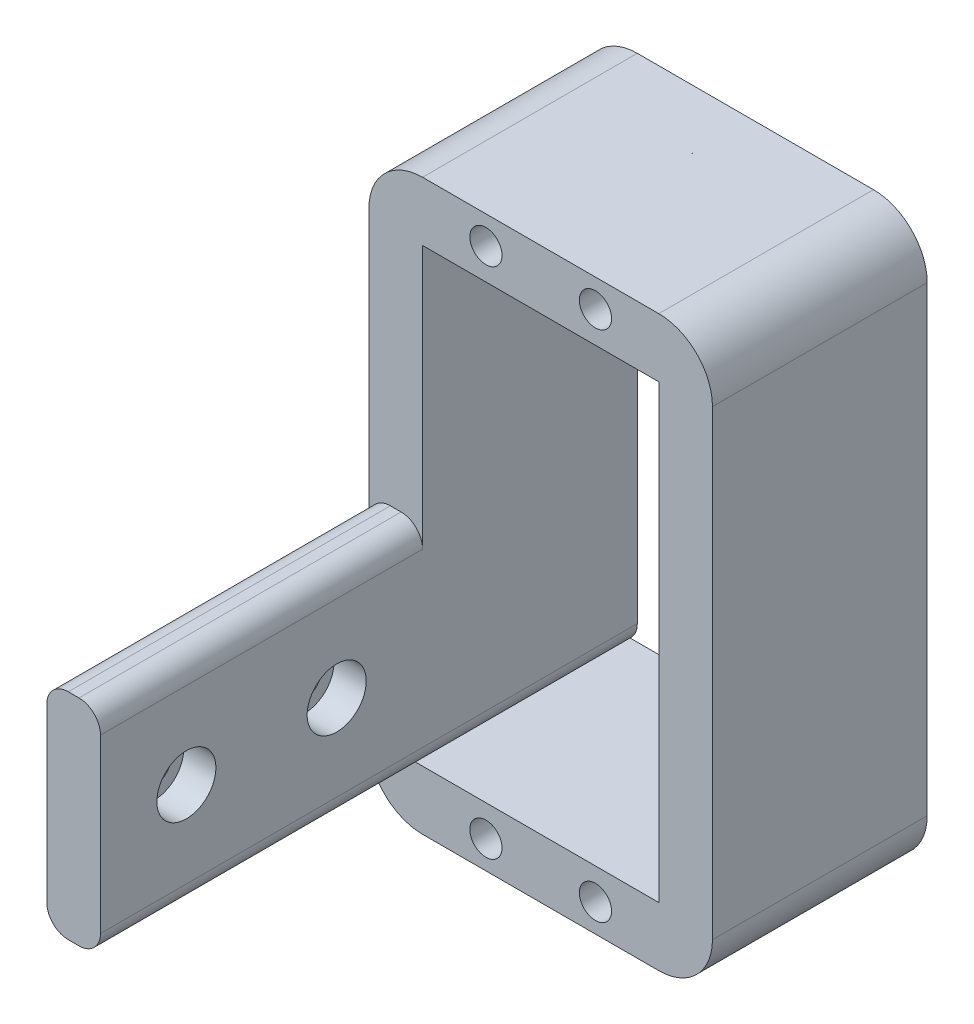
ISO-10303-21;
HEADER;
FILE_DESCRIPTION(('STEP AP214'),'2;1');
FILE_NAME('part.step','',(''),(''),'','','');
FILE_SCHEMA(('AUTOMOTIVE_DESIGN { 1 0 10303 214 1 1 1 1 }'));
ENDSEC;
DATA;
#1=APPLICATION_CONTEXT('core data for automotive mechanical design processes');
#2=APPLICATION_PROTOCOL_DEFINITION('international standard','automotive_design',2000,#1);
#3=PRODUCT_CONTEXT('',#1,'mechanical');
#4=PRODUCT('Part','Part','',(#3));
#5=PRODUCT_RELATED_PRODUCT_CATEGORY('part','',(#4));
#6=PRODUCT_DEFINITION_FORMATION('','',#4);
#7=PRODUCT_DEFINITION_CONTEXT('part definition',#1,'design');
#8=PRODUCT_DEFINITION('design','',#6,#7);
#9=PRODUCT_DEFINITION_SHAPE('','',#8);
#10=(LENGTH_UNIT() NAMED_UNIT(*) SI_UNIT(.MILLI.,.METRE.));
#11=(NAMED_UNIT(*) PLANE_ANGLE_UNIT() SI_UNIT($,.RADIAN.));
#12=(NAMED_UNIT(*) SI_UNIT($,.STERADIAN.) SOLID_ANGLE_UNIT());
#13=UNCERTAINTY_MEASURE_WITH_UNIT(LENGTH_MEASURE(1.E-05),#10,'distance_accuracy_value','');
#14=(GEOMETRIC_REPRESENTATION_CONTEXT(3) GLOBAL_UNCERTAINTY_ASSIGNED_CONTEXT((#13)) GLOBAL_UNIT_ASSIGNED_CONTEXT((#10,
#11,#12)) REPRESENTATION_CONTEXT('',''));
#15=CARTESIAN_POINT('',(0.,0.,0.));
#16=DIRECTION('',(0.,0.,1.));
#17=DIRECTION('',(1.,0.,0.));
#18=AXIS2_PLACEMENT_3D('',#15,#16,#17);
#19=CARTESIAN_POINT('',(0.,0.,20.));
#20=DIRECTION('',(0.,0.,1.));
#21=DIRECTION('',(1.,0.,0.));
#22=AXIS2_PLACEMENT_3D('',#19,#20,#21);
#23=PLANE('',#22);
#24=CARTESIAN_POINT('',(-5.1,-23.8999999999999,20.));
#25=DIRECTION('',(0.,0.,1.));
#26=DIRECTION('',(1.,0.,0.));
#27=AXIS2_PLACEMENT_3D('',#24,#25,#26);
#28=CIRCLE('',#27,1.5);
#29=CARTESIAN_POINT('',(-3.6,-23.8999999999999,20.));
#30=VERTEX_POINT('',#29);
#31=EDGE_CURVE('E352',#30,#30,#28,.T.);
#32=ORIENTED_EDGE('',*,*,#31,.F.);
#33=EDGE_LOOP('',(#32));
#34=FACE_BOUND('',#33,.T.);
#35=CARTESIAN_POINT('',(5.1,23.9000000000001,20.));
#36=DIRECTION('',(0.,0.,1.));
#37=DIRECTION('',(1.,0.,0.));
#38=AXIS2_PLACEMENT_3D('',#35,#36,#37);
#39=CIRCLE('',#38,1.5);
#40=CARTESIAN_POINT('',(6.6,23.9000000000001,20.));
#41=VERTEX_POINT('',#40);
#42=EDGE_CURVE('E357',#41,#41,#39,.T.);
#43=ORIENTED_EDGE('',*,*,#42,.F.);
#44=EDGE_LOOP('',(#43));
#45=FACE_BOUND('',#44,.T.);
#46=CARTESIAN_POINT('',(-5.1,23.9000000000001,20.));
#47=DIRECTION('',(0.,0.,1.));
#48=DIRECTION('',(1.,0.,0.));
#49=AXIS2_PLACEMENT_3D('',#46,#47,#48);
#50=CIRCLE('',#49,1.5);
#51=CARTESIAN_POINT('',(-3.6,23.9000000000001,20.));
#52=VERTEX_POINT('',#51);
#53=EDGE_CURVE('E360',#52,#52,#50,.T.);
#54=ORIENTED_EDGE('',*,*,#53,.F.);
#55=EDGE_LOOP('',(#54));
#56=FACE_BOUND('',#55,.T.);
#57=CARTESIAN_POINT('',(5.1,-23.8999999999999,20.));
#58=DIRECTION('',(0.,0.,1.));
#59=DIRECTION('',(1.,0.,0.));
#60=AXIS2_PLACEMENT_3D('',#57,#58,#59);
#61=CIRCLE('',#60,1.5);
#62=CARTESIAN_POINT('',(6.6,-23.8999999999999,20.));
#63=VERTEX_POINT('',#62);
#64=EDGE_CURVE('E363',#63,#63,#61,.T.);
#65=ORIENTED_EDGE('',*,*,#64,.F.);
#66=EDGE_LOOP('',(#65));
#67=FACE_BOUND('',#66,.T.);
#68=DIRECTION('',(1.,0.,0.));
#69=VECTOR('',#68,1.);
#70=CARTESIAN_POINT('',(-16.,-21.5,20.));
#71=LINE('',#70,#69);
#72=CARTESIAN_POINT('',(-14.,-21.5,20.));
#73=VERTEX_POINT('',#72);
#74=CARTESIAN_POINT('',(-13.,-21.5,20.));
#75=VERTEX_POINT('',#74);
#76=EDGE_CURVE('E310',#73,#75,#71,.T.);
#77=ORIENTED_EDGE('',*,*,#76,.F.);
#78=CARTESIAN_POINT('',(-14.,-19.5,20.));
#79=DIRECTION('',(0.,0.,1.));
#80=DIRECTION('',(1.,0.,0.));
#81=AXIS2_PLACEMENT_3D('',#78,#79,#80);
#82=CIRCLE('',#81,2.);
#83=CARTESIAN_POINT('',(-16.,-19.5,20.));
#84=VERTEX_POINT('',#83);
#85=EDGE_CURVE('E299',#73,#84,#82,.F.);
#86=ORIENTED_EDGE('',*,*,#85,.T.);
#87=DIRECTION('',(0.,1.,0.));
#88=VECTOR('',#87,1.);
#89=CARTESIAN_POINT('',(-16.,0.,20.));
#90=LINE('',#89,#88);
#91=CARTESIAN_POINT('',(-16.,-21.5,20.));
#92=VERTEX_POINT('',#91);
#93=EDGE_CURVE('E54',#92,#84,#90,.T.);
#94=ORIENTED_EDGE('',*,*,#93,.F.);
#95=CARTESIAN_POINT('',(-11.,-21.5,20.));
#96=DIRECTION('',(0.,0.,1.));
#97=DIRECTION('',(1.,0.,0.));
#98=AXIS2_PLACEMENT_3D('',#95,#96,#97);
#99=CIRCLE('',#98,5.);
#100=CARTESIAN_POINT('',(-11.,-26.5,20.));
#101=VERTEX_POINT('',#100);
#102=EDGE_CURVE('E253',#92,#101,#99,.T.);
#103=ORIENTED_EDGE('',*,*,#102,.T.);
#104=DIRECTION('',(1.,0.,0.));
#105=VECTOR('',#104,1.);
#106=CARTESIAN_POINT('',(-16.,-26.5,20.));
#107=LINE('',#106,#105);
#108=CARTESIAN_POINT('',(11.,-26.5,20.));
#109=VERTEX_POINT('',#108);
#110=EDGE_CURVE('E216',#101,#109,#107,.T.);
#111=ORIENTED_EDGE('',*,*,#110,.T.);
#112=CARTESIAN_POINT('',(11.,-21.5,20.));
#113=DIRECTION('',(0.,0.,1.));
#114=DIRECTION('',(1.,0.,0.));
#115=AXIS2_PLACEMENT_3D('',#112,#113,#114);
#116=CIRCLE('',#115,5.);
#117=CARTESIAN_POINT('',(16.,-21.5,20.));
#118=VERTEX_POINT('',#117);
#119=EDGE_CURVE('E251',#109,#118,#116,.T.);
#120=ORIENTED_EDGE('',*,*,#119,.T.);
#121=DIRECTION('',(0.,1.,0.));
#122=VECTOR('',#121,1.);
#123=CARTESIAN_POINT('',(16.,26.5,20.));
#124=LINE('',#123,#122);
#125=CARTESIAN_POINT('',(16.,21.5,20.));
#126=VERTEX_POINT('',#125);
#127=EDGE_CURVE('E207',#118,#126,#124,.T.);
#128=ORIENTED_EDGE('',*,*,#127,.T.);
#129=CARTESIAN_POINT('',(11.,21.5,20.));
#130=DIRECTION('',(0.,0.,1.));
#131=DIRECTION('',(1.,0.,0.));
#132=AXIS2_PLACEMENT_3D('',#129,#130,#131);
#133=CIRCLE('',#132,5.);
#134=CARTESIAN_POINT('',(11.,26.5,20.));
#135=VERTEX_POINT('',#134);
#136=EDGE_CURVE('E247',#126,#135,#133,.T.);
#137=ORIENTED_EDGE('',*,*,#136,.T.);
#138=DIRECTION('',(-1.,0.,0.));
#139=VECTOR('',#138,1.);
#140=CARTESIAN_POINT('',(-16.,26.5,20.));
#141=LINE('',#140,#139);
#142=CARTESIAN_POINT('',(-11.,26.5,20.));
#143=VERTEX_POINT('',#142);
#144=EDGE_CURVE('E210',#135,#143,#141,.T.);
#145=ORIENTED_EDGE('',*,*,#144,.T.);
#146=CARTESIAN_POINT('',(-11.,21.5,20.));
#147=DIRECTION('',(0.,0.,1.));
#148=DIRECTION('',(1.,0.,0.));
#149=AXIS2_PLACEMENT_3D('',#146,#147,#148);
#150=CIRCLE('',#149,5.);
#151=CARTESIAN_POINT('',(-16.,21.5,20.));
#152=VERTEX_POINT('',#151);
#153=EDGE_CURVE('E249',#143,#152,#150,.T.);
#154=ORIENTED_EDGE('',*,*,#153,.T.);
#155=DIRECTION('',(0.,-1.,0.));
#156=VECTOR('',#155,1.);
#157=CARTESIAN_POINT('',(-16.,26.5,20.));
#158=LINE('',#157,#156);
#159=CARTESIAN_POINT('',(-16.,-3.5,20.));
#160=VERTEX_POINT('',#159);
#161=EDGE_CURVE('E214',#152,#160,#158,.T.);
#162=ORIENTED_EDGE('',*,*,#161,.T.);
#163=CARTESIAN_POINT('',(-14.,-3.5,20.));
#164=DIRECTION('',(0.,0.,1.));
#165=DIRECTION('',(1.,0.,0.));
#166=AXIS2_PLACEMENT_3D('',#163,#164,#165);
#167=CIRCLE('',#166,2.);
#168=CARTESIAN_POINT('',(-14.,-1.5,20.));
#169=VERTEX_POINT('',#168);
#170=EDGE_CURVE('E297',#160,#169,#167,.F.);
#171=ORIENTED_EDGE('',*,*,#170,.T.);
#172=DIRECTION('',(-1.,0.,0.));
#173=VECTOR('',#172,1.);
#174=CARTESIAN_POINT('',(-16.,-1.5,20.));
#175=LINE('',#174,#173);
#176=CARTESIAN_POINT('',(-13.,-1.5,20.));
#177=VERTEX_POINT('',#176);
#178=EDGE_CURVE('E316',#177,#169,#175,.T.);
#179=ORIENTED_EDGE('',*,*,#178,.F.);
#180=CARTESIAN_POINT('',(-13.,-3.5,20.));
#181=DIRECTION('',(0.,0.,1.));
#182=DIRECTION('',(1.,0.,0.));
#183=AXIS2_PLACEMENT_3D('',#180,#181,#182);
#184=CIRCLE('',#183,2.);
#185=CARTESIAN_POINT('',(-11.,-3.5,20.));
#186=VERTEX_POINT('',#185);
#187=EDGE_CURVE('E301',#177,#186,#184,.F.);
#188=ORIENTED_EDGE('',*,*,#187,.T.);
#189=DIRECTION('',(0.,-1.,0.));
#190=VECTOR('',#189,1.);
#191=CARTESIAN_POINT('',(-11.,21.,20.));
#192=LINE('',#191,#190);
#193=CARTESIAN_POINT('',(-11.,21.,20.));
#194=VERTEX_POINT('',#193);
#195=EDGE_CURVE('E190',#194,#186,#192,.T.);
#196=ORIENTED_EDGE('',*,*,#195,.F.);
#197=DIRECTION('',(-1.,0.,0.));
#198=VECTOR('',#197,1.);
#199=CARTESIAN_POINT('',(-11.,21.,20.));
#200=LINE('',#199,#198);
#201=CARTESIAN_POINT('',(11.,21.,20.));
#202=VERTEX_POINT('',#201);
#203=EDGE_CURVE('E176',#202,#194,#200,.T.);
#204=ORIENTED_EDGE('',*,*,#203,.F.);
#205=DIRECTION('',(0.,1.,0.));
#206=VECTOR('',#205,1.);
#207=CARTESIAN_POINT('',(11.,21.,20.));
#208=LINE('',#207,#206);
#209=CARTESIAN_POINT('',(11.,-21.,20.));
#210=VERTEX_POINT('',#209);
#211=EDGE_CURVE('E168',#210,#202,#208,.T.);
#212=ORIENTED_EDGE('',*,*,#211,.F.);
#213=DIRECTION('',(1.,0.,0.));
#214=VECTOR('',#213,1.);
#215=CARTESIAN_POINT('',(-11.,-21.,20.));
#216=LINE('',#215,#214);
#217=CARTESIAN_POINT('',(-11.6771243444677,-21.,20.));
#218=VERTEX_POINT('',#217);
#219=EDGE_CURVE('E47',#218,#210,#216,.T.);
#220=ORIENTED_EDGE('',*,*,#219,.F.);
#221=CARTESIAN_POINT('',(-13.,-19.5,20.));
#222=DIRECTION('',(0.,0.,1.));
#223=DIRECTION('',(1.,0.,0.));
#224=AXIS2_PLACEMENT_3D('',#221,#222,#223);
#225=CIRCLE('',#224,2.);
#226=EDGE_CURVE('E11',#218,#75,#225,.F.);
#227=ORIENTED_EDGE('',*,*,#226,.T.);
#228=EDGE_LOOP('',(#77,#86,#94,#103,#111,#120,#128,#137,#145,#154,#162,#171,#179,#188,#196,#204,
#212,#220,#227));
#229=FACE_BOUND('',#228,.T.);
#230=ADVANCED_FACE('F33',(#34,#45,#56,#67,#229),#23,.T.);
#231=CARTESIAN_POINT('',(0.,0.,0.));
#232=DIRECTION('',(0.,0.,1.));
#233=DIRECTION('',(1.,0.,0.));
#234=AXIS2_PLACEMENT_3D('',#231,#232,#233);
#235=PLANE('',#234);
#236=CARTESIAN_POINT('',(-5.1,-23.8999999999999,0.));
#237=DIRECTION('',(0.,0.,-1.));
#238=DIRECTION('',(-1.,0.,0.));
#239=AXIS2_PLACEMENT_3D('',#236,#237,#238);
#240=CIRCLE('',#239,1.5);
#241=CARTESIAN_POINT('',(-6.6,-23.8999999999999,0.));
#242=VERTEX_POINT('',#241);
#243=EDGE_CURVE('E369',#242,#242,#240,.T.);
#244=ORIENTED_EDGE('',*,*,#243,.F.);
#245=EDGE_LOOP('',(#244));
#246=FACE_BOUND('',#245,.T.);
#247=CARTESIAN_POINT('',(5.1,23.9000000000001,0.));
#248=DIRECTION('',(0.,0.,-1.));
#249=DIRECTION('',(-1.,0.,0.));
#250=AXIS2_PLACEMENT_3D('',#247,#248,#249);
#251=CIRCLE('',#250,1.5);
#252=CARTESIAN_POINT('',(3.6,23.9000000000001,0.));
#253=VERTEX_POINT('',#252);
#254=EDGE_CURVE('E370',#253,#253,#251,.T.);
#255=ORIENTED_EDGE('',*,*,#254,.F.);
#256=EDGE_LOOP('',(#255));
#257=FACE_BOUND('',#256,.T.);
#258=CARTESIAN_POINT('',(-5.1,23.9000000000001,0.));
#259=DIRECTION('',(0.,0.,-1.));
#260=DIRECTION('',(-1.,0.,0.));
#261=AXIS2_PLACEMENT_3D('',#258,#259,#260);
#262=CIRCLE('',#261,1.5);
#263=CARTESIAN_POINT('',(-6.6,23.9000000000001,0.));
#264=VERTEX_POINT('',#263);
#265=EDGE_CURVE('E373',#264,#264,#262,.T.);
#266=ORIENTED_EDGE('',*,*,#265,.F.);
#267=EDGE_LOOP('',(#266));
#268=FACE_BOUND('',#267,.T.);
#269=CARTESIAN_POINT('',(5.1,-23.8999999999999,0.));
#270=DIRECTION('',(0.,0.,-1.));
#271=DIRECTION('',(-1.,0.,0.));
#272=AXIS2_PLACEMENT_3D('',#269,#270,#271);
#273=CIRCLE('',#272,1.5);
#274=CARTESIAN_POINT('',(3.59999999999999,-23.8999999999999,0.));
#275=VERTEX_POINT('',#274);
#276=EDGE_CURVE('E366',#275,#275,#273,.T.);
#277=ORIENTED_EDGE('',*,*,#276,.F.);
#278=EDGE_LOOP('',(#277));
#279=FACE_BOUND('',#278,.T.);
#280=DIRECTION('',(1.,0.,0.));
#281=VECTOR('',#280,1.);
#282=CARTESIAN_POINT('',(-16.,-26.5,0.));
#283=LINE('',#282,#281);
#284=CARTESIAN_POINT('',(-11.,-26.5,0.));
#285=VERTEX_POINT('',#284);
#286=CARTESIAN_POINT('',(11.,-26.5,0.));
#287=VERTEX_POINT('',#286);
#288=EDGE_CURVE('E211',#285,#287,#283,.T.);
#289=ORIENTED_EDGE('',*,*,#288,.F.);
#290=CARTESIAN_POINT('',(-11.,-21.5,0.));
#291=DIRECTION('',(0.,0.,1.));
#292=DIRECTION('',(1.,0.,0.));
#293=AXIS2_PLACEMENT_3D('',#290,#291,#292);
#294=CIRCLE('',#293,5.);
#295=CARTESIAN_POINT('',(-16.,-21.5,0.));
#296=VERTEX_POINT('',#295);
#297=EDGE_CURVE('E240',#285,#296,#294,.F.);
#298=ORIENTED_EDGE('',*,*,#297,.T.);
#299=DIRECTION('',(0.,-1.,0.));
#300=VECTOR('',#299,1.);
#301=CARTESIAN_POINT('',(-16.,26.5,0.));
#302=LINE('',#301,#300);
#303=CARTESIAN_POINT('',(-16.,21.5,0.));
#304=VERTEX_POINT('',#303);
#305=EDGE_CURVE('E225',#304,#296,#302,.T.);
#306=ORIENTED_EDGE('',*,*,#305,.F.);
#307=CARTESIAN_POINT('',(-11.,21.5,0.));
#308=DIRECTION('',(0.,0.,1.));
#309=DIRECTION('',(1.,0.,0.));
#310=AXIS2_PLACEMENT_3D('',#307,#308,#309);
#311=CIRCLE('',#310,5.);
#312=CARTESIAN_POINT('',(-11.,26.5,0.));
#313=VERTEX_POINT('',#312);
#314=EDGE_CURVE('E236',#304,#313,#311,.F.);
#315=ORIENTED_EDGE('',*,*,#314,.T.);
#316=DIRECTION('',(-1.,0.,0.));
#317=VECTOR('',#316,1.);
#318=CARTESIAN_POINT('',(-16.,26.5,0.));
#319=LINE('',#318,#317);
#320=CARTESIAN_POINT('',(11.,26.5,0.));
#321=VERTEX_POINT('',#320);
#322=EDGE_CURVE('E222',#321,#313,#319,.T.);
#323=ORIENTED_EDGE('',*,*,#322,.F.);
#324=CARTESIAN_POINT('',(11.,21.5,0.));
#325=DIRECTION('',(0.,0.,1.));
#326=DIRECTION('',(1.,0.,0.));
#327=AXIS2_PLACEMENT_3D('',#324,#325,#326);
#328=CIRCLE('',#327,5.);
#329=CARTESIAN_POINT('',(16.,21.5,0.));
#330=VERTEX_POINT('',#329);
#331=EDGE_CURVE('E234',#321,#330,#328,.F.);
#332=ORIENTED_EDGE('',*,*,#331,.T.);
#333=DIRECTION('',(0.,1.,0.));
#334=VECTOR('',#333,1.);
#335=CARTESIAN_POINT('',(16.,26.5,0.));
#336=LINE('',#335,#334);
#337=CARTESIAN_POINT('',(16.,-21.5,0.));
#338=VERTEX_POINT('',#337);
#339=EDGE_CURVE('E184',#338,#330,#336,.T.);
#340=ORIENTED_EDGE('',*,*,#339,.F.);
#341=CARTESIAN_POINT('',(11.,-21.5,0.));
#342=DIRECTION('',(0.,0.,1.));
#343=DIRECTION('',(1.,0.,0.));
#344=AXIS2_PLACEMENT_3D('',#341,#342,#343);
#345=CIRCLE('',#344,5.);
#346=EDGE_CURVE('E238',#338,#287,#345,.F.);
#347=ORIENTED_EDGE('',*,*,#346,.T.);
#348=EDGE_LOOP('',(#289,#298,#306,#315,#323,#332,#340,#347));
#349=FACE_BOUND('',#348,.T.);
#350=CARTESIAN_POINT('',(-13.,-19.5,0.));
#351=DIRECTION('',(0.,0.,1.));
#352=DIRECTION('',(1.,0.,0.));
#353=AXIS2_PLACEMENT_3D('',#350,#351,#352);
#354=CIRCLE('',#353,2.);
#355=CARTESIAN_POINT('',(-11.,-19.5,0.));
#356=VERTEX_POINT('',#355);
#357=CARTESIAN_POINT('',(-11.6771243444677,-21.,0.));
#358=VERTEX_POINT('',#357);
#359=EDGE_CURVE('E294',#356,#358,#354,.F.);
#360=ORIENTED_EDGE('',*,*,#359,.T.);
#361=DIRECTION('',(1.,0.,0.));
#362=VECTOR('',#361,1.);
#363=CARTESIAN_POINT('',(-11.,-21.,0.));
#364=LINE('',#363,#362);
#365=CARTESIAN_POINT('',(11.,-21.,0.));
#366=VERTEX_POINT('',#365);
#367=EDGE_CURVE('E177',#358,#366,#364,.T.);
#368=ORIENTED_EDGE('',*,*,#367,.T.);
#369=DIRECTION('',(0.,1.,0.));
#370=VECTOR('',#369,1.);
#371=CARTESIAN_POINT('',(11.,21.,0.));
#372=LINE('',#371,#370);
#373=CARTESIAN_POINT('',(11.,21.,0.));
#374=VERTEX_POINT('',#373);
#375=EDGE_CURVE('E196',#366,#374,#372,.T.);
#376=ORIENTED_EDGE('',*,*,#375,.T.);
#377=DIRECTION('',(-1.,0.,0.));
#378=VECTOR('',#377,1.);
#379=CARTESIAN_POINT('',(-11.,21.,0.));
#380=LINE('',#379,#378);
#381=CARTESIAN_POINT('',(-11.,21.,0.));
#382=VERTEX_POINT('',#381);
#383=EDGE_CURVE('E183',#374,#382,#380,.T.);
#384=ORIENTED_EDGE('',*,*,#383,.T.);
#385=DIRECTION('',(0.,-1.,0.));
#386=VECTOR('',#385,1.);
#387=CARTESIAN_POINT('',(-11.,21.,0.));
#388=LINE('',#387,#386);
#389=EDGE_CURVE('E200',#382,#356,#388,.T.);
#390=ORIENTED_EDGE('',*,*,#389,.T.);
#391=EDGE_LOOP('',(#360,#368,#376,#384,#390));
#392=FACE_BOUND('',#391,.T.);
#393=ADVANCED_FACE('F381',(#246,#257,#268,#279,#349,#392),#235,.F.);
#394=CARTESIAN_POINT('',(16.,26.5,20.));
#395=DIRECTION('',(-1.,0.,0.));
#396=DIRECTION('',(0.,0.,1.));
#397=AXIS2_PLACEMENT_3D('',#394,#395,#396);
#398=PLANE('',#397);
#399=ORIENTED_EDGE('',*,*,#127,.F.);
#400=DIRECTION('',(0.,0.,-1.));
#401=VECTOR('',#400,1.);
#402=CARTESIAN_POINT('',(16.,-21.5,20.));
#403=LINE('',#402,#401);
#404=EDGE_CURVE('E257',#118,#338,#403,.T.);
#405=ORIENTED_EDGE('',*,*,#404,.T.);
#406=ORIENTED_EDGE('',*,*,#339,.T.);
#407=DIRECTION('',(0.,0.,-1.));
#408=VECTOR('',#407,1.);
#409=CARTESIAN_POINT('',(16.,21.5,20.));
#410=LINE('',#409,#408);
#411=EDGE_CURVE('E255',#330,#126,#410,.F.);
#412=ORIENTED_EDGE('',*,*,#411,.T.);
#413=EDGE_LOOP('',(#399,#405,#406,#412));
#414=FACE_BOUND('',#413,.T.);
#415=ADVANCED_FACE('F384',(#414),#398,.F.);
#416=CARTESIAN_POINT('',(-16.,26.5,20.));
#417=DIRECTION('',(0.,-1.,0.));
#418=DIRECTION('',(0.,0.,-1.));
#419=AXIS2_PLACEMENT_3D('',#416,#417,#418);
#420=PLANE('',#419);
#421=ORIENTED_EDGE('',*,*,#322,.T.);
#422=DIRECTION('',(0.,0.,-1.));
#423=VECTOR('',#422,1.);
#424=CARTESIAN_POINT('',(-11.,26.5,20.));
#425=LINE('',#424,#423);
#426=EDGE_CURVE('E263',#313,#143,#425,.F.);
#427=ORIENTED_EDGE('',*,*,#426,.T.);
#428=ORIENTED_EDGE('',*,*,#144,.F.);
#429=DIRECTION('',(0.,0.,-1.));
#430=VECTOR('',#429,1.);
#431=CARTESIAN_POINT('',(11.,26.5,20.));
#432=LINE('',#431,#430);
#433=EDGE_CURVE('E260',#135,#321,#432,.T.);
#434=ORIENTED_EDGE('',*,*,#433,.T.);
#435=EDGE_LOOP('',(#421,#427,#428,#434));
#436=FACE_BOUND('',#435,.T.);
#437=ADVANCED_FACE('F447',(#436),#420,.F.);
#438=CARTESIAN_POINT('',(-16.,26.5,20.));
#439=DIRECTION('',(1.,0.,0.));
#440=DIRECTION('',(0.,0.,-1.));
#441=AXIS2_PLACEMENT_3D('',#438,#439,#440);
#442=PLANE('',#441);
#443=CARTESIAN_POINT('',(-16.,-11.5,42.));
#444=DIRECTION('',(1.,0.,0.));
#445=DIRECTION('',(0.,0.,-1.));
#446=AXIS2_PLACEMENT_3D('',#443,#444,#445);
#447=CIRCLE('',#446,1.6);
#448=CARTESIAN_POINT('',(-16.,-11.5,40.4));
#449=VERTEX_POINT('',#448);
#450=EDGE_CURVE('E348',#449,#449,#447,.T.);
#451=ORIENTED_EDGE('',*,*,#450,.T.);
#452=EDGE_LOOP('',(#451));
#453=FACE_BOUND('',#452,.T.);
#454=CARTESIAN_POINT('',(-16.,-11.5,28.));
#455=DIRECTION('',(1.,0.,0.));
#456=DIRECTION('',(0.,0.,-1.));
#457=AXIS2_PLACEMENT_3D('',#454,#455,#456);
#458=CIRCLE('',#457,1.6);
#459=CARTESIAN_POINT('',(-16.,-11.5,26.4));
#460=VERTEX_POINT('',#459);
#461=EDGE_CURVE('E349',#460,#460,#458,.T.);
#462=ORIENTED_EDGE('',*,*,#461,.T.);
#463=EDGE_LOOP('',(#462));
#464=FACE_BOUND('',#463,.T.);
#465=DIRECTION('',(0.,-1.,0.));
#466=VECTOR('',#465,1.);
#467=CARTESIAN_POINT('',(-16.,-21.5,50.));
#468=LINE('',#467,#466);
#469=CARTESIAN_POINT('',(-16.,-3.5,50.));
#470=VERTEX_POINT('',#469);
#471=CARTESIAN_POINT('',(-16.,-19.5,50.));
#472=VERTEX_POINT('',#471);
#473=EDGE_CURVE('E320',#470,#472,#468,.T.);
#474=ORIENTED_EDGE('',*,*,#473,.F.);
#475=DIRECTION('',(0.,0.,-1.));
#476=VECTOR('',#475,1.);
#477=CARTESIAN_POINT('',(-16.,-3.5,20.));
#478=LINE('',#477,#476);
#479=EDGE_CURVE('E268',#470,#160,#478,.T.);
#480=ORIENTED_EDGE('',*,*,#479,.T.);
#481=ORIENTED_EDGE('',*,*,#161,.F.);
#482=DIRECTION('',(0.,0.,-1.));
#483=VECTOR('',#482,1.);
#484=CARTESIAN_POINT('',(-16.,21.5,20.));
#485=LINE('',#484,#483);
#486=EDGE_CURVE('E242',#152,#304,#485,.T.);
#487=ORIENTED_EDGE('',*,*,#486,.T.);
#488=ORIENTED_EDGE('',*,*,#305,.T.);
#489=DIRECTION('',(0.,0.,-1.));
#490=VECTOR('',#489,1.);
#491=CARTESIAN_POINT('',(-16.,-21.5,20.));
#492=LINE('',#491,#490);
#493=EDGE_CURVE('E245',#296,#92,#492,.F.);
#494=ORIENTED_EDGE('',*,*,#493,.T.);
#495=ORIENTED_EDGE('',*,*,#93,.T.);
#496=DIRECTION('',(0.,0.,-1.));
#497=VECTOR('',#496,1.);
#498=CARTESIAN_POINT('',(-16.,-19.5,20.));
#499=LINE('',#498,#497);
#500=EDGE_CURVE('E265',#84,#472,#499,.F.);
#501=ORIENTED_EDGE('',*,*,#500,.T.);
#502=EDGE_LOOP('',(#474,#480,#481,#487,#488,#494,#495,#501));
#503=FACE_BOUND('',#502,.T.);
#504=ADVANCED_FACE('F416',(#453,#464,#503),#442,.F.);
#505=CARTESIAN_POINT('',(-16.,-26.5,20.));
#506=DIRECTION('',(0.,1.,0.));
#507=DIRECTION('',(0.,0.,1.));
#508=AXIS2_PLACEMENT_3D('',#505,#506,#507);
#509=PLANE('',#508);
#510=ORIENTED_EDGE('',*,*,#110,.F.);
#511=DIRECTION('',(0.,0.,-1.));
#512=VECTOR('',#511,1.);
#513=CARTESIAN_POINT('',(-11.,-26.5,20.));
#514=LINE('',#513,#512);
#515=EDGE_CURVE('E231',#101,#285,#514,.T.);
#516=ORIENTED_EDGE('',*,*,#515,.T.);
#517=ORIENTED_EDGE('',*,*,#288,.T.);
#518=DIRECTION('',(0.,0.,-1.));
#519=VECTOR('',#518,1.);
#520=CARTESIAN_POINT('',(11.,-26.5,20.));
#521=LINE('',#520,#519);
#522=EDGE_CURVE('E219',#287,#109,#521,.F.);
#523=ORIENTED_EDGE('',*,*,#522,.T.);
#524=EDGE_LOOP('',(#510,#516,#517,#523));
#525=FACE_BOUND('',#524,.T.);
#526=ADVANCED_FACE('F431',(#525),#509,.F.);
#527=CARTESIAN_POINT('',(11.,21.,20.));
#528=DIRECTION('',(-1.,0.,0.));
#529=DIRECTION('',(0.,-1.,0.));
#530=AXIS2_PLACEMENT_3D('',#527,#528,#529);
#531=PLANE('',#530);
#532=ORIENTED_EDGE('',*,*,#375,.F.);
#533=DIRECTION('',(0.,0.,-1.));
#534=VECTOR('',#533,1.);
#535=CARTESIAN_POINT('',(11.,-21.,20.));
#536=LINE('',#535,#534);
#537=EDGE_CURVE('E174',#210,#366,#536,.T.);
#538=ORIENTED_EDGE('',*,*,#537,.F.);
#539=ORIENTED_EDGE('',*,*,#211,.T.);
#540=DIRECTION('',(0.,0.,-1.));
#541=VECTOR('',#540,1.);
#542=CARTESIAN_POINT('',(11.,21.,20.));
#543=LINE('',#542,#541);
#544=EDGE_CURVE('E171',#202,#374,#543,.T.);
#545=ORIENTED_EDGE('',*,*,#544,.T.);
#546=EDGE_LOOP('',(#532,#538,#539,#545));
#547=FACE_BOUND('',#546,.T.);
#548=ADVANCED_FACE('F170',(#547),#531,.T.);
#549=CARTESIAN_POINT('',(-11.,21.,20.));
#550=DIRECTION('',(0.,-1.,0.));
#551=DIRECTION('',(0.,0.,-1.));
#552=AXIS2_PLACEMENT_3D('',#549,#550,#551);
#553=PLANE('',#552);
#554=ORIENTED_EDGE('',*,*,#383,.F.);
#555=ORIENTED_EDGE('',*,*,#544,.F.);
#556=ORIENTED_EDGE('',*,*,#203,.T.);
#557=DIRECTION('',(0.,0.,-1.));
#558=VECTOR('',#557,1.);
#559=CARTESIAN_POINT('',(-11.,21.,20.));
#560=LINE('',#559,#558);
#561=EDGE_CURVE('E185',#194,#382,#560,.T.);
#562=ORIENTED_EDGE('',*,*,#561,.T.);
#563=EDGE_LOOP('',(#554,#555,#556,#562));
#564=FACE_BOUND('',#563,.T.);
#565=ADVANCED_FACE('F180',(#564),#553,.T.);
#566=CARTESIAN_POINT('',(-11.,21.,20.));
#567=DIRECTION('',(1.,0.,0.));
#568=DIRECTION('',(0.,0.,-1.));
#569=AXIS2_PLACEMENT_3D('',#566,#567,#568);
#570=PLANE('',#569);
#571=CARTESIAN_POINT('',(-11.,-11.5,42.));
#572=DIRECTION('',(1.,0.,0.));
#573=DIRECTION('',(0.,0.,-1.));
#574=AXIS2_PLACEMENT_3D('',#571,#572,#573);
#575=CIRCLE('',#574,2.75);
#576=CARTESIAN_POINT('',(-11.,-11.5,39.25));
#577=VERTEX_POINT('',#576);
#578=EDGE_CURVE('E322',#577,#577,#575,.T.);
#579=ORIENTED_EDGE('',*,*,#578,.F.);
#580=EDGE_LOOP('',(#579));
#581=FACE_BOUND('',#580,.T.);
#582=CARTESIAN_POINT('',(-11.,-11.5,28.));
#583=DIRECTION('',(1.,0.,0.));
#584=DIRECTION('',(0.,0.,-1.));
#585=AXIS2_PLACEMENT_3D('',#582,#583,#584);
#586=CIRCLE('',#585,2.75);
#587=CARTESIAN_POINT('',(-11.,-11.5,25.25));
#588=VERTEX_POINT('',#587);
#589=EDGE_CURVE('E334',#588,#588,#586,.T.);
#590=ORIENTED_EDGE('',*,*,#589,.F.);
#591=EDGE_LOOP('',(#590));
#592=FACE_BOUND('',#591,.T.);
#593=ORIENTED_EDGE('',*,*,#195,.T.);
#594=DIRECTION('',(0.,0.,-1.));
#595=VECTOR('',#594,1.);
#596=CARTESIAN_POINT('',(-11.,-3.5,50.));
#597=LINE('',#596,#595);
#598=CARTESIAN_POINT('',(-11.,-3.5,50.));
#599=VERTEX_POINT('',#598);
#600=EDGE_CURVE('E292',#186,#599,#597,.F.);
#601=ORIENTED_EDGE('',*,*,#600,.T.);
#602=DIRECTION('',(0.,1.,0.));
#603=VECTOR('',#602,1.);
#604=CARTESIAN_POINT('',(-11.,-21.5,50.));
#605=LINE('',#604,#603);
#606=CARTESIAN_POINT('',(-11.,-19.5,50.));
#607=VERTEX_POINT('',#606);
#608=EDGE_CURVE('E327',#607,#599,#605,.T.);
#609=ORIENTED_EDGE('',*,*,#608,.F.);
#610=DIRECTION('',(0.,0.,-1.));
#611=VECTOR('',#610,1.);
#612=CARTESIAN_POINT('',(-11.,-19.5,20.));
#613=LINE('',#612,#611);
#614=EDGE_CURVE('E289',#607,#356,#613,.T.);
#615=ORIENTED_EDGE('',*,*,#614,.T.);
#616=ORIENTED_EDGE('',*,*,#389,.F.);
#617=ORIENTED_EDGE('',*,*,#561,.F.);
#618=EDGE_LOOP('',(#593,#601,#609,#615,#616,#617));
#619=FACE_BOUND('',#618,.T.);
#620=ADVANCED_FACE('F395',(#581,#592,#619),#570,.T.);
#621=CARTESIAN_POINT('',(-11.,-21.,20.));
#622=DIRECTION('',(0.,1.,0.));
#623=DIRECTION('',(0.,0.,1.));
#624=AXIS2_PLACEMENT_3D('',#621,#622,#623);
#625=PLANE('',#624);
#626=ORIENTED_EDGE('',*,*,#367,.F.);
#627=DIRECTION('',(0.,0.,1.));
#628=VECTOR('',#627,1.);
#629=CARTESIAN_POINT('',(-11.6771243444677,-21.,0.));
#630=LINE('',#629,#628);
#631=EDGE_CURVE('E41',#358,#218,#630,.T.);
#632=ORIENTED_EDGE('',*,*,#631,.T.);
#633=ORIENTED_EDGE('',*,*,#219,.T.);
#634=ORIENTED_EDGE('',*,*,#537,.T.);
#635=EDGE_LOOP('',(#626,#632,#633,#634));
#636=FACE_BOUND('',#635,.T.);
#637=ADVANCED_FACE('F305',(#636),#625,.T.);
#638=CARTESIAN_POINT('',(-16.,-21.5,50.));
#639=DIRECTION('',(0.,1.,0.));
#640=DIRECTION('',(0.,0.,1.));
#641=AXIS2_PLACEMENT_3D('',#638,#639,#640);
#642=PLANE('',#641);
#643=DIRECTION('',(1.,0.,0.));
#644=VECTOR('',#643,1.);
#645=CARTESIAN_POINT('',(-16.,-21.5,50.));
#646=LINE('',#645,#644);
#647=CARTESIAN_POINT('',(-14.,-21.5,50.));
#648=VERTEX_POINT('',#647);
#649=CARTESIAN_POINT('',(-13.,-21.5,50.));
#650=VERTEX_POINT('',#649);
#651=EDGE_CURVE('E330',#648,#650,#646,.T.);
#652=ORIENTED_EDGE('',*,*,#651,.F.);
#653=DIRECTION('',(0.,0.,-1.));
#654=VECTOR('',#653,1.);
#655=CARTESIAN_POINT('',(-14.,-21.5,50.));
#656=LINE('',#655,#654);
#657=EDGE_CURVE('E286',#648,#73,#656,.T.);
#658=ORIENTED_EDGE('',*,*,#657,.T.);
#659=ORIENTED_EDGE('',*,*,#76,.T.);
#660=DIRECTION('',(0.,0.,-1.));
#661=VECTOR('',#660,1.);
#662=CARTESIAN_POINT('',(-13.,-21.5,50.));
#663=LINE('',#662,#661);
#664=EDGE_CURVE('E284',#75,#650,#663,.F.);
#665=ORIENTED_EDGE('',*,*,#664,.T.);
#666=EDGE_LOOP('',(#652,#658,#659,#665));
#667=FACE_BOUND('',#666,.T.);
#668=ADVANCED_FACE('F313',(#667),#642,.F.);
#669=CARTESIAN_POINT('',(-16.,-1.5,50.));
#670=DIRECTION('',(0.,-1.,0.));
#671=DIRECTION('',(1.,0.,0.));
#672=AXIS2_PLACEMENT_3D('',#669,#670,#671);
#673=PLANE('',#672);
#674=ORIENTED_EDGE('',*,*,#178,.T.);
#675=DIRECTION('',(0.,0.,-1.));
#676=VECTOR('',#675,1.);
#677=CARTESIAN_POINT('',(-14.,-1.5,50.));
#678=LINE('',#677,#676);
#679=CARTESIAN_POINT('',(-14.,-1.5,50.));
#680=VERTEX_POINT('',#679);
#681=EDGE_CURVE('E274',#169,#680,#678,.F.);
#682=ORIENTED_EDGE('',*,*,#681,.T.);
#683=DIRECTION('',(-1.,0.,0.));
#684=VECTOR('',#683,1.);
#685=CARTESIAN_POINT('',(-16.,-1.5,50.));
#686=LINE('',#685,#684);
#687=CARTESIAN_POINT('',(-13.,-1.5,50.));
#688=VERTEX_POINT('',#687);
#689=EDGE_CURVE('E198',#688,#680,#686,.T.);
#690=ORIENTED_EDGE('',*,*,#689,.F.);
#691=DIRECTION('',(0.,0.,-1.));
#692=VECTOR('',#691,1.);
#693=CARTESIAN_POINT('',(-13.,-1.5,20.));
#694=LINE('',#693,#692);
#695=EDGE_CURVE('E271',#688,#177,#694,.T.);
#696=ORIENTED_EDGE('',*,*,#695,.T.);
#697=EDGE_LOOP('',(#674,#682,#690,#696));
#698=FACE_BOUND('',#697,.T.);
#699=ADVANCED_FACE('F406',(#698),#673,.F.);
#700=CARTESIAN_POINT('',(0.,0.,50.));
#701=DIRECTION('',(0.,0.,-1.));
#702=DIRECTION('',(-1.,0.,0.));
#703=AXIS2_PLACEMENT_3D('',#700,#701,#702);
#704=PLANE('',#703);
#705=ORIENTED_EDGE('',*,*,#689,.T.);
#706=CARTESIAN_POINT('',(-14.,-3.5,50.));
#707=DIRECTION('',(0.,0.,-1.));
#708=DIRECTION('',(-1.,0.,0.));
#709=AXIS2_PLACEMENT_3D('',#706,#707,#708);
#710=CIRCLE('',#709,2.);
#711=EDGE_CURVE('E282',#680,#470,#710,.F.);
#712=ORIENTED_EDGE('',*,*,#711,.T.);
#713=ORIENTED_EDGE('',*,*,#473,.T.);
#714=CARTESIAN_POINT('',(-14.,-19.5,50.));
#715=DIRECTION('',(0.,0.,-1.));
#716=DIRECTION('',(-1.,0.,0.));
#717=AXIS2_PLACEMENT_3D('',#714,#715,#716);
#718=CIRCLE('',#717,2.);
#719=EDGE_CURVE('E280',#472,#648,#718,.F.);
#720=ORIENTED_EDGE('',*,*,#719,.T.);
#721=ORIENTED_EDGE('',*,*,#651,.T.);
#722=CARTESIAN_POINT('',(-13.,-19.5,50.));
#723=DIRECTION('',(0.,0.,-1.));
#724=DIRECTION('',(-1.,0.,0.));
#725=AXIS2_PLACEMENT_3D('',#722,#723,#724);
#726=CIRCLE('',#725,2.);
#727=EDGE_CURVE('E276',#650,#607,#726,.F.);
#728=ORIENTED_EDGE('',*,*,#727,.T.);
#729=ORIENTED_EDGE('',*,*,#608,.T.);
#730=CARTESIAN_POINT('',(-13.,-3.5,50.));
#731=DIRECTION('',(0.,0.,-1.));
#732=DIRECTION('',(-1.,0.,0.));
#733=AXIS2_PLACEMENT_3D('',#730,#731,#732);
#734=CIRCLE('',#733,2.);
#735=EDGE_CURVE('E278',#599,#688,#734,.F.);
#736=ORIENTED_EDGE('',*,*,#735,.T.);
#737=EDGE_LOOP('',(#705,#712,#713,#720,#721,#728,#729,#736));
#738=FACE_BOUND('',#737,.T.);
#739=ADVANCED_FACE('F399',(#738),#704,.F.);
#740=CARTESIAN_POINT('',(-14.,-11.5,28.));
#741=DIRECTION('',(1.,0.,0.));
#742=DIRECTION('',(0.,0.,-1.));
#743=AXIS2_PLACEMENT_3D('',#740,#741,#742);
#744=CYLINDRICAL_SURFACE('',#743,2.75);
#745=CARTESIAN_POINT('',(-14.,-11.5,28.));
#746=DIRECTION('',(1.,0.,0.));
#747=DIRECTION('',(0.,0.,-1.));
#748=AXIS2_PLACEMENT_3D('',#745,#746,#747);
#749=CIRCLE('',#748,2.75);
#750=CARTESIAN_POINT('',(-14.,-11.5,25.25));
#751=VERTEX_POINT('',#750);
#752=EDGE_CURVE('E337',#751,#751,#749,.T.);
#753=ORIENTED_EDGE('',*,*,#752,.F.);
#754=EDGE_LOOP('',(#753));
#755=FACE_BOUND('',#754,.T.);
#756=ORIENTED_EDGE('',*,*,#589,.T.);
#757=EDGE_LOOP('',(#756));
#758=FACE_BOUND('',#757,.T.);
#759=ADVANCED_FACE('F518',(#755,#758),#744,.F.);
#760=CARTESIAN_POINT('',(-14.,-11.5,28.));
#761=DIRECTION('',(1.,0.,0.));
#762=DIRECTION('',(0.,0.,-1.));
#763=AXIS2_PLACEMENT_3D('',#760,#761,#762);
#764=PLANE('',#763);
#765=CARTESIAN_POINT('',(-14.,-11.5,28.));
#766=DIRECTION('',(1.,0.,0.));
#767=DIRECTION('',(0.,0.,-1.));
#768=AXIS2_PLACEMENT_3D('',#765,#766,#767);
#769=CIRCLE('',#768,1.6);
#770=CARTESIAN_POINT('',(-14.,-11.5,26.4));
#771=VERTEX_POINT('',#770);
#772=EDGE_CURVE('E338',#771,#771,#769,.T.);
#773=ORIENTED_EDGE('',*,*,#772,.F.);
#774=EDGE_LOOP('',(#773));
#775=FACE_BOUND('',#774,.T.);
#776=ORIENTED_EDGE('',*,*,#752,.T.);
#777=EDGE_LOOP('',(#776));
#778=FACE_BOUND('',#777,.T.);
#779=ADVANCED_FACE('F514',(#775,#778),#764,.T.);
#780=CARTESIAN_POINT('',(-14.,-11.5,42.));
#781=DIRECTION('',(1.,0.,0.));
#782=DIRECTION('',(0.,0.,-1.));
#783=AXIS2_PLACEMENT_3D('',#780,#781,#782);
#784=CYLINDRICAL_SURFACE('',#783,2.75);
#785=CARTESIAN_POINT('',(-14.,-11.5,42.));
#786=DIRECTION('',(1.,0.,0.));
#787=DIRECTION('',(0.,0.,-1.));
#788=AXIS2_PLACEMENT_3D('',#785,#786,#787);
#789=CIRCLE('',#788,2.75);
#790=CARTESIAN_POINT('',(-14.,-11.5,39.25));
#791=VERTEX_POINT('',#790);
#792=EDGE_CURVE('E317',#791,#791,#789,.T.);
#793=ORIENTED_EDGE('',*,*,#792,.F.);
#794=EDGE_LOOP('',(#793));
#795=FACE_BOUND('',#794,.T.);
#796=ORIENTED_EDGE('',*,*,#578,.T.);
#797=EDGE_LOOP('',(#796));
#798=FACE_BOUND('',#797,.T.);
#799=ADVANCED_FACE('F510',(#795,#798),#784,.F.);
#800=CARTESIAN_POINT('',(-14.,-11.5,42.));
#801=DIRECTION('',(1.,0.,0.));
#802=DIRECTION('',(0.,0.,-1.));
#803=AXIS2_PLACEMENT_3D('',#800,#801,#802);
#804=PLANE('',#803);
#805=CARTESIAN_POINT('',(-14.,-11.5,42.));
#806=DIRECTION('',(1.,0.,0.));
#807=DIRECTION('',(0.,0.,-1.));
#808=AXIS2_PLACEMENT_3D('',#805,#806,#807);
#809=CIRCLE('',#808,1.6);
#810=CARTESIAN_POINT('',(-14.,-11.5,40.4));
#811=VERTEX_POINT('',#810);
#812=EDGE_CURVE('E345',#811,#811,#809,.T.);
#813=ORIENTED_EDGE('',*,*,#812,.F.);
#814=EDGE_LOOP('',(#813));
#815=FACE_BOUND('',#814,.T.);
#816=ORIENTED_EDGE('',*,*,#792,.T.);
#817=EDGE_LOOP('',(#816));
#818=FACE_BOUND('',#817,.T.);
#819=ADVANCED_FACE('F503',(#815,#818),#804,.T.);
#820=CARTESIAN_POINT('',(-16.,-11.5,42.));
#821=DIRECTION('',(1.,0.,0.));
#822=DIRECTION('',(0.,0.,-1.));
#823=AXIS2_PLACEMENT_3D('',#820,#821,#822);
#824=CYLINDRICAL_SURFACE('',#823,1.6);
#825=ORIENTED_EDGE('',*,*,#812,.T.);
#826=EDGE_LOOP('',(#825));
#827=FACE_BOUND('',#826,.T.);
#828=ORIENTED_EDGE('',*,*,#450,.F.);
#829=EDGE_LOOP('',(#828));
#830=FACE_BOUND('',#829,.T.);
#831=ADVANCED_FACE('F500',(#827,#830),#824,.F.);
#832=CARTESIAN_POINT('',(-16.,-11.5,28.));
#833=DIRECTION('',(1.,0.,0.));
#834=DIRECTION('',(0.,0.,-1.));
#835=AXIS2_PLACEMENT_3D('',#832,#833,#834);
#836=CYLINDRICAL_SURFACE('',#835,1.6);
#837=ORIENTED_EDGE('',*,*,#772,.T.);
#838=EDGE_LOOP('',(#837));
#839=FACE_BOUND('',#838,.T.);
#840=ORIENTED_EDGE('',*,*,#461,.F.);
#841=EDGE_LOOP('',(#840));
#842=FACE_BOUND('',#841,.T.);
#843=ADVANCED_FACE('F498',(#839,#842),#836,.F.);
#844=CARTESIAN_POINT('',(5.1,-23.8999999999999,50.));
#845=DIRECTION('',(0.,0.,-1.));
#846=DIRECTION('',(-1.,0.,0.));
#847=AXIS2_PLACEMENT_3D('',#844,#845,#846);
#848=CYLINDRICAL_SURFACE('',#847,1.5);
#849=ORIENTED_EDGE('',*,*,#64,.T.);
#850=EDGE_LOOP('',(#849));
#851=FACE_BOUND('',#850,.T.);
#852=ORIENTED_EDGE('',*,*,#276,.T.);
#853=EDGE_LOOP('',(#852));
#854=FACE_BOUND('',#853,.T.);
#855=ADVANCED_FACE('F495',(#851,#854),#848,.F.);
#856=CARTESIAN_POINT('',(-5.1,23.9000000000001,50.));
#857=DIRECTION('',(0.,0.,-1.));
#858=DIRECTION('',(-1.,0.,0.));
#859=AXIS2_PLACEMENT_3D('',#856,#857,#858);
#860=CYLINDRICAL_SURFACE('',#859,1.5);
#861=ORIENTED_EDGE('',*,*,#53,.T.);
#862=EDGE_LOOP('',(#861));
#863=FACE_BOUND('',#862,.T.);
#864=ORIENTED_EDGE('',*,*,#265,.T.);
#865=EDGE_LOOP('',(#864));
#866=FACE_BOUND('',#865,.T.);
#867=ADVANCED_FACE('F379',(#863,#866),#860,.F.);
#868=CARTESIAN_POINT('',(5.1,23.9000000000001,50.));
#869=DIRECTION('',(0.,0.,-1.));
#870=DIRECTION('',(-1.,0.,0.));
#871=AXIS2_PLACEMENT_3D('',#868,#869,#870);
#872=CYLINDRICAL_SURFACE('',#871,1.5);
#873=ORIENTED_EDGE('',*,*,#42,.T.);
#874=EDGE_LOOP('',(#873));
#875=FACE_BOUND('',#874,.T.);
#876=ORIENTED_EDGE('',*,*,#254,.T.);
#877=EDGE_LOOP('',(#876));
#878=FACE_BOUND('',#877,.T.);
#879=ADVANCED_FACE('F484',(#875,#878),#872,.F.);
#880=CARTESIAN_POINT('',(-5.1,-23.8999999999999,50.));
#881=DIRECTION('',(0.,0.,-1.));
#882=DIRECTION('',(-1.,0.,0.));
#883=AXIS2_PLACEMENT_3D('',#880,#881,#882);
#884=CYLINDRICAL_SURFACE('',#883,1.5);
#885=ORIENTED_EDGE('',*,*,#31,.T.);
#886=EDGE_LOOP('',(#885));
#887=FACE_BOUND('',#886,.T.);
#888=ORIENTED_EDGE('',*,*,#243,.T.);
#889=EDGE_LOOP('',(#888));
#890=FACE_BOUND('',#889,.T.);
#891=ADVANCED_FACE('F480',(#887,#890),#884,.F.);
#892=CARTESIAN_POINT('',(-11.,-21.5,20.));
#893=DIRECTION('',(0.,0.,-1.));
#894=DIRECTION('',(-1.,0.,0.));
#895=AXIS2_PLACEMENT_3D('',#892,#893,#894);
#896=CYLINDRICAL_SURFACE('',#895,5.);
#897=ORIENTED_EDGE('',*,*,#102,.F.);
#898=ORIENTED_EDGE('',*,*,#493,.F.);
#899=ORIENTED_EDGE('',*,*,#297,.F.);
#900=ORIENTED_EDGE('',*,*,#515,.F.);
#901=EDGE_LOOP('',(#897,#898,#899,#900));
#902=FACE_BOUND('',#901,.T.);
#903=ADVANCED_FACE('F427',(#902),#896,.T.);
#904=CARTESIAN_POINT('',(11.,-21.5,20.));
#905=DIRECTION('',(0.,0.,-1.));
#906=DIRECTION('',(-1.,0.,0.));
#907=AXIS2_PLACEMENT_3D('',#904,#905,#906);
#908=CYLINDRICAL_SURFACE('',#907,5.);
#909=ORIENTED_EDGE('',*,*,#119,.F.);
#910=ORIENTED_EDGE('',*,*,#522,.F.);
#911=ORIENTED_EDGE('',*,*,#346,.F.);
#912=ORIENTED_EDGE('',*,*,#404,.F.);
#913=EDGE_LOOP('',(#909,#910,#911,#912));
#914=FACE_BOUND('',#913,.T.);
#915=ADVANCED_FACE('F434',(#914),#908,.T.);
#916=CARTESIAN_POINT('',(-11.,21.5,20.));
#917=DIRECTION('',(0.,0.,-1.));
#918=DIRECTION('',(-1.,0.,0.));
#919=AXIS2_PLACEMENT_3D('',#916,#917,#918);
#920=CYLINDRICAL_SURFACE('',#919,5.);
#921=ORIENTED_EDGE('',*,*,#153,.F.);
#922=ORIENTED_EDGE('',*,*,#426,.F.);
#923=ORIENTED_EDGE('',*,*,#314,.F.);
#924=ORIENTED_EDGE('',*,*,#486,.F.);
#925=EDGE_LOOP('',(#921,#922,#923,#924));
#926=FACE_BOUND('',#925,.T.);
#927=ADVANCED_FACE('F451',(#926),#920,.T.);
#928=CARTESIAN_POINT('',(11.,21.5,20.));
#929=DIRECTION('',(0.,0.,-1.));
#930=DIRECTION('',(-1.,0.,0.));
#931=AXIS2_PLACEMENT_3D('',#928,#929,#930);
#932=CYLINDRICAL_SURFACE('',#931,5.);
#933=ORIENTED_EDGE('',*,*,#136,.F.);
#934=ORIENTED_EDGE('',*,*,#411,.F.);
#935=ORIENTED_EDGE('',*,*,#331,.F.);
#936=ORIENTED_EDGE('',*,*,#433,.F.);
#937=EDGE_LOOP('',(#933,#934,#935,#936));
#938=FACE_BOUND('',#937,.T.);
#939=ADVANCED_FACE('F442',(#938),#932,.T.);
#940=CARTESIAN_POINT('',(-14.,-3.5,20.));
#941=DIRECTION('',(0.,0.,-1.));
#942=DIRECTION('',(-1.,0.,0.));
#943=AXIS2_PLACEMENT_3D('',#940,#941,#942);
#944=CYLINDRICAL_SURFACE('',#943,2.);
#945=ORIENTED_EDGE('',*,*,#711,.F.);
#946=ORIENTED_EDGE('',*,*,#681,.F.);
#947=ORIENTED_EDGE('',*,*,#170,.F.);
#948=ORIENTED_EDGE('',*,*,#479,.F.);
#949=EDGE_LOOP('',(#945,#946,#947,#948));
#950=FACE_BOUND('',#949,.T.);
#951=ADVANCED_FACE('F413',(#950),#944,.T.);
#952=CARTESIAN_POINT('',(-14.,-19.5,50.));
#953=DIRECTION('',(0.,0.,-1.));
#954=DIRECTION('',(-1.,0.,0.));
#955=AXIS2_PLACEMENT_3D('',#952,#953,#954);
#956=CYLINDRICAL_SURFACE('',#955,2.);
#957=ORIENTED_EDGE('',*,*,#719,.F.);
#958=ORIENTED_EDGE('',*,*,#500,.F.);
#959=ORIENTED_EDGE('',*,*,#85,.F.);
#960=ORIENTED_EDGE('',*,*,#657,.F.);
#961=EDGE_LOOP('',(#957,#958,#959,#960));
#962=FACE_BOUND('',#961,.T.);
#963=ADVANCED_FACE('F421',(#962),#956,.T.);
#964=CARTESIAN_POINT('',(-13.,-3.5,50.));
#965=DIRECTION('',(0.,0.,1.));
#966=DIRECTION('',(1.,0.,0.));
#967=AXIS2_PLACEMENT_3D('',#964,#965,#966);
#968=CYLINDRICAL_SURFACE('',#967,2.);
#969=ORIENTED_EDGE('',*,*,#735,.F.);
#970=ORIENTED_EDGE('',*,*,#600,.F.);
#971=ORIENTED_EDGE('',*,*,#187,.F.);
#972=ORIENTED_EDGE('',*,*,#695,.F.);
#973=EDGE_LOOP('',(#969,#970,#971,#972));
#974=FACE_BOUND('',#973,.T.);
#975=ADVANCED_FACE('F403',(#974),#968,.T.);
#976=CARTESIAN_POINT('',(-13.,-19.5,20.));
#977=DIRECTION('',(0.,0.,1.));
#978=DIRECTION('',(1.,0.,0.));
#979=AXIS2_PLACEMENT_3D('',#976,#977,#978);
#980=CYLINDRICAL_SURFACE('',#979,2.);
#981=ORIENTED_EDGE('',*,*,#727,.F.);
#982=ORIENTED_EDGE('',*,*,#664,.F.);
#983=ORIENTED_EDGE('',*,*,#226,.F.);
#984=ORIENTED_EDGE('',*,*,#631,.F.);
#985=ORIENTED_EDGE('',*,*,#359,.F.);
#986=ORIENTED_EDGE('',*,*,#614,.F.);
#987=EDGE_LOOP('',(#981,#982,#983,#984,#985,#986));
#988=FACE_BOUND('',#987,.T.);
#989=ADVANCED_FACE('F35',(#988),#980,.T.);
#990=CLOSED_SHELL('',(#230,#393,#415,#437,#504,#526,#548,#565,#620,#637,#668,#699,#739,#759,
#779,#799,#819,#831,#843,#855,#867,#879,#891,#903,#915,#927,#939,#951,#963,#975,#989));
#991=MANIFOLD_SOLID_BREP('B2',#990);
#992=ADVANCED_BREP_SHAPE_REPRESENTATION('',(#18,#991),#14);
#993=SHAPE_DEFINITION_REPRESENTATION(#9,#992);
ENDSEC;
END-ISO-10303-21;
